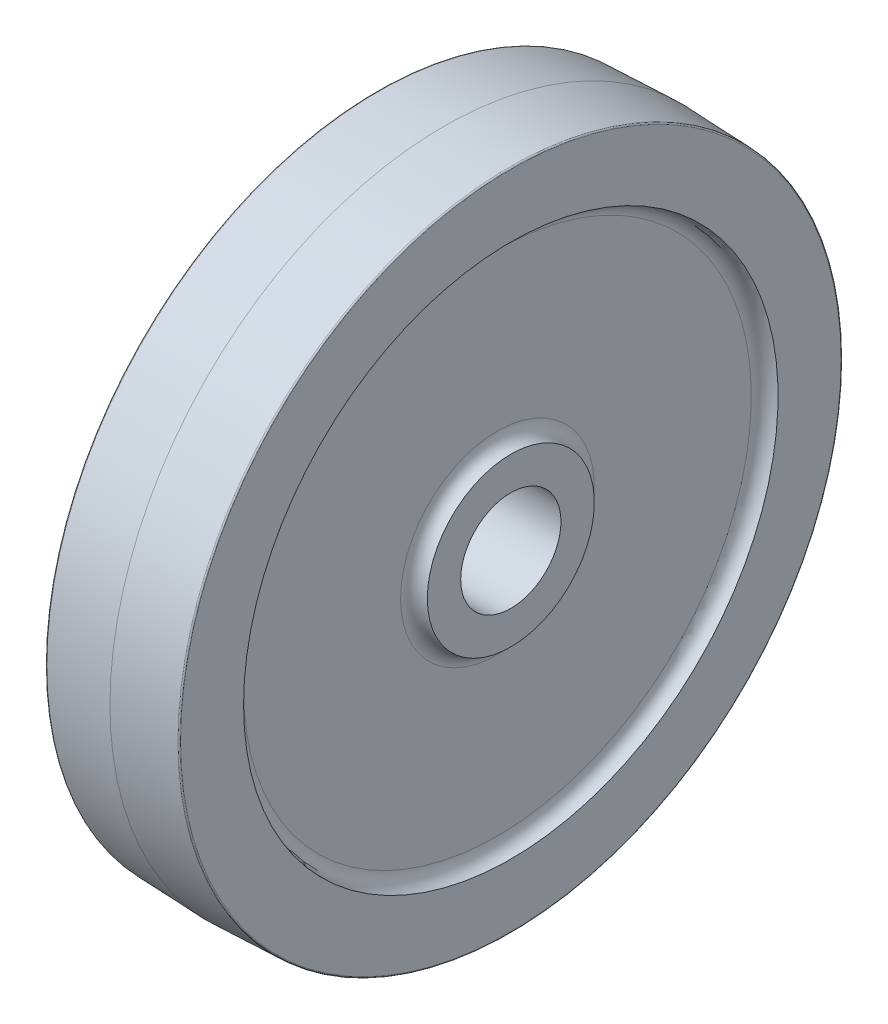
ISO-10303-21;
HEADER;
FILE_DESCRIPTION(('STEP AP214'),'2;1');
FILE_NAME('part.step','',(''),(''),'','','');
FILE_SCHEMA(('AUTOMOTIVE_DESIGN { 1 0 10303 214 1 1 1 1 }'));
ENDSEC;
DATA;
#1=APPLICATION_CONTEXT('core data for automotive mechanical design processes');
#2=APPLICATION_PROTOCOL_DEFINITION('international standard','automotive_design',2000,#1);
#3=PRODUCT_CONTEXT('',#1,'mechanical');
#4=PRODUCT('Part','Part','',(#3));
#5=PRODUCT_RELATED_PRODUCT_CATEGORY('part','',(#4));
#6=PRODUCT_DEFINITION_FORMATION('','',#4);
#7=PRODUCT_DEFINITION_CONTEXT('part definition',#1,'design');
#8=PRODUCT_DEFINITION('design','',#6,#7);
#9=PRODUCT_DEFINITION_SHAPE('','',#8);
#10=(LENGTH_UNIT() NAMED_UNIT(*) SI_UNIT(.MILLI.,.METRE.));
#11=(NAMED_UNIT(*) PLANE_ANGLE_UNIT() SI_UNIT($,.RADIAN.));
#12=(NAMED_UNIT(*) SI_UNIT($,.STERADIAN.) SOLID_ANGLE_UNIT());
#13=UNCERTAINTY_MEASURE_WITH_UNIT(LENGTH_MEASURE(1.E-05),#10,'distance_accuracy_value','');
#14=(GEOMETRIC_REPRESENTATION_CONTEXT(3) GLOBAL_UNCERTAINTY_ASSIGNED_CONTEXT((#13)) GLOBAL_UNIT_ASSIGNED_CONTEXT((#10,
#11,#12)) REPRESENTATION_CONTEXT('',''));
#15=CARTESIAN_POINT('',(0.,0.,0.));
#16=DIRECTION('',(0.,0.,1.));
#17=DIRECTION('',(1.,0.,0.));
#18=AXIS2_PLACEMENT_3D('',#15,#16,#17);
#19=CARTESIAN_POINT('',(10.4668676212676,0.,0.));
#20=DIRECTION('',(-1.,0.,0.));
#21=DIRECTION('',(0.,0.,1.));
#22=AXIS2_PLACEMENT_3D('',#19,#20,#21);
#23=TOROIDAL_SURFACE('',#22,62.7731550712937,0.254);
#24=CARTESIAN_POINT('',(10.4765068324478,0.,0.));
#25=DIRECTION('',(-1.,0.,0.));
#26=DIRECTION('',(0.,0.,1.));
#27=AXIS2_PLACEMENT_3D('',#24,#25,#26);
#28=CIRCLE('',#27,63.0269721030465);
#29=CARTESIAN_POINT('',(10.4765068324478,0.,63.0269721030465));
#30=VERTEX_POINT('',#29);
#31=EDGE_CURVE('E10',#30,#30,#28,.T.);
#32=ORIENTED_EDGE('',*,*,#31,.F.);
#33=EDGE_LOOP('',(#32));
#34=FACE_BOUND('',#33,.T.);
#35=CARTESIAN_POINT('',(10.7208676212676,0.,0.));
#36=DIRECTION('',(-1.,0.,0.));
#37=DIRECTION('',(0.,0.,1.));
#38=AXIS2_PLACEMENT_3D('',#35,#36,#37);
#39=CIRCLE('',#38,62.7731550712937);
#40=CARTESIAN_POINT('',(10.7208676212676,0.,62.7731550712937));
#41=VERTEX_POINT('',#40);
#42=EDGE_CURVE('E64',#41,#41,#39,.T.);
#43=ORIENTED_EDGE('',*,*,#42,.T.);
#44=EDGE_LOOP('',(#43));
#45=FACE_BOUND('',#44,.T.);
#46=ADVANCED_FACE('F15',(#34,#45),#23,.T.);
#47=CARTESIAN_POINT('',(10.4765068324478,0.,0.));
#48=DIRECTION('',(-1.,0.,0.));
#49=DIRECTION('',(0.,0.,1.));
#50=AXIS2_PLACEMENT_3D('',#47,#48,#49);
#51=CONICAL_SURFACE('',#50,63.0269721030465,0.0379587652532191);
#52=CARTESIAN_POINT('',(-1.97913237873238,0.,0.));
#53=DIRECTION('',(-1.,0.,0.));
#54=DIRECTION('',(0.,0.,1.));
#55=AXIS2_PLACEMENT_3D('',#52,#53,#54);
#56=CIRCLE('',#55,63.5);
#57=CARTESIAN_POINT('',(-1.97913237873238,0.,63.5));
#58=VERTEX_POINT('',#57);
#59=EDGE_CURVE('E21',#58,#58,#56,.T.);
#60=ORIENTED_EDGE('',*,*,#59,.F.);
#61=EDGE_LOOP('',(#60));
#62=FACE_BOUND('',#61,.T.);
#63=ORIENTED_EDGE('',*,*,#31,.T.);
#64=EDGE_LOOP('',(#63));
#65=FACE_BOUND('',#64,.T.);
#66=ADVANCED_FACE('F143',(#62,#65),#51,.T.);
#67=CARTESIAN_POINT('',(-1.97913237873238,0.,0.));
#68=DIRECTION('',(1.,0.,0.));
#69=DIRECTION('',(0.,0.,-1.));
#70=AXIS2_PLACEMENT_3D('',#67,#68,#69);
#71=CONICAL_SURFACE('',#70,63.5,0.037958765253218);
#72=CARTESIAN_POINT('',(-14.4347715899126,0.,0.));
#73=DIRECTION('',(-1.,0.,0.));
#74=DIRECTION('',(0.,0.,1.));
#75=AXIS2_PLACEMENT_3D('',#72,#73,#74);
#76=CIRCLE('',#75,63.0269721030465);
#77=CARTESIAN_POINT('',(-14.4347715899126,0.,63.0269721030465));
#78=VERTEX_POINT('',#77);
#79=EDGE_CURVE('E25',#78,#78,#76,.T.);
#80=ORIENTED_EDGE('',*,*,#79,.F.);
#81=EDGE_LOOP('',(#80));
#82=FACE_BOUND('',#81,.T.);
#83=ORIENTED_EDGE('',*,*,#59,.T.);
#84=EDGE_LOOP('',(#83));
#85=FACE_BOUND('',#84,.T.);
#86=ADVANCED_FACE('F138',(#82,#85),#71,.T.);
#87=CARTESIAN_POINT('',(-14.4251323787324,0.,0.));
#88=DIRECTION('',(-1.,0.,0.));
#89=DIRECTION('',(0.,0.,1.));
#90=AXIS2_PLACEMENT_3D('',#87,#88,#89);
#91=TOROIDAL_SURFACE('',#90,62.7731550712937,0.253999999999992);
#92=CARTESIAN_POINT('',(-14.6791323787324,0.,0.));
#93=DIRECTION('',(-1.,0.,0.));
#94=DIRECTION('',(0.,0.,1.));
#95=AXIS2_PLACEMENT_3D('',#92,#93,#94);
#96=CIRCLE('',#95,62.7731550712937);
#97=CARTESIAN_POINT('',(-14.6791323787324,0.,62.7731550712937));
#98=VERTEX_POINT('',#97);
#99=EDGE_CURVE('E29',#98,#98,#96,.T.);
#100=ORIENTED_EDGE('',*,*,#99,.F.);
#101=EDGE_LOOP('',(#100));
#102=FACE_BOUND('',#101,.T.);
#103=ORIENTED_EDGE('',*,*,#79,.T.);
#104=EDGE_LOOP('',(#103));
#105=FACE_BOUND('',#104,.T.);
#106=ADVANCED_FACE('F132',(#102,#105),#91,.T.);
#107=CARTESIAN_POINT('',(-14.6791323787324,62.7731550712937,0.));
#108=DIRECTION('',(1.,0.,0.));
#109=DIRECTION('',(0.,0.,-1.));
#110=AXIS2_PLACEMENT_3D('',#107,#108,#109);
#111=PLANE('',#110);
#112=CARTESIAN_POINT('',(-14.6791323787324,0.,0.));
#113=DIRECTION('',(-1.,0.,0.));
#114=DIRECTION('',(0.,0.,1.));
#115=AXIS2_PLACEMENT_3D('',#112,#113,#114);
#116=CIRCLE('',#115,50.8);
#117=CARTESIAN_POINT('',(-14.6791323787324,0.,50.8));
#118=VERTEX_POINT('',#117);
#119=EDGE_CURVE('E34',#118,#118,#116,.T.);
#120=ORIENTED_EDGE('',*,*,#119,.F.);
#121=EDGE_LOOP('',(#120));
#122=FACE_BOUND('',#121,.T.);
#123=ORIENTED_EDGE('',*,*,#99,.T.);
#124=EDGE_LOOP('',(#123));
#125=FACE_BOUND('',#124,.T.);
#126=ADVANCED_FACE('F126',(#122,#125),#111,.F.);
#127=CARTESIAN_POINT('',(-14.6791323787324,0.,0.));
#128=DIRECTION('',(-1.,0.,0.));
#129=DIRECTION('',(0.,0.,1.));
#130=AXIS2_PLACEMENT_3D('',#127,#128,#129);
#131=TOROIDAL_SURFACE('',#130,48.26,2.54);
#132=CARTESIAN_POINT('',(-12.1391323787324,0.,0.));
#133=DIRECTION('',(-1.,0.,0.));
#134=DIRECTION('',(0.,0.,1.));
#135=AXIS2_PLACEMENT_3D('',#132,#133,#134);
#136=CIRCLE('',#135,48.26);
#137=CARTESIAN_POINT('',(-12.1391323787324,0.,48.26));
#138=VERTEX_POINT('',#137);
#139=EDGE_CURVE('E37',#138,#138,#136,.T.);
#140=ORIENTED_EDGE('',*,*,#139,.F.);
#141=EDGE_LOOP('',(#140));
#142=FACE_BOUND('',#141,.T.);
#143=ORIENTED_EDGE('',*,*,#119,.T.);
#144=EDGE_LOOP('',(#143));
#145=FACE_BOUND('',#144,.T.);
#146=ADVANCED_FACE('F120',(#142,#145),#131,.F.);
#147=CARTESIAN_POINT('',(-12.1391323787324,48.26,0.));
#148=DIRECTION('',(1.,0.,0.));
#149=DIRECTION('',(0.,0.,-1.));
#150=AXIS2_PLACEMENT_3D('',#147,#148,#149);
#151=PLANE('',#150);
#152=CARTESIAN_POINT('',(-12.1391323787324,0.,0.));
#153=DIRECTION('',(-1.,0.,0.));
#154=DIRECTION('',(0.,0.,1.));
#155=AXIS2_PLACEMENT_3D('',#152,#153,#154);
#156=CIRCLE('',#155,18.415);
#157=CARTESIAN_POINT('',(-12.1391323787324,0.,18.415));
#158=VERTEX_POINT('',#157);
#159=EDGE_CURVE('E40',#158,#158,#156,.T.);
#160=ORIENTED_EDGE('',*,*,#159,.F.);
#161=EDGE_LOOP('',(#160));
#162=FACE_BOUND('',#161,.T.);
#163=ORIENTED_EDGE('',*,*,#139,.T.);
#164=EDGE_LOOP('',(#163));
#165=FACE_BOUND('',#164,.T.);
#166=ADVANCED_FACE('F114',(#162,#165),#151,.F.);
#167=CARTESIAN_POINT('',(-14.6791323787324,0.,0.));
#168=DIRECTION('',(-1.,0.,0.));
#169=DIRECTION('',(0.,0.,1.));
#170=AXIS2_PLACEMENT_3D('',#167,#168,#169);
#171=TOROIDAL_SURFACE('',#170,18.415,2.54);
#172=CARTESIAN_POINT('',(-14.6791323787324,0.,0.));
#173=DIRECTION('',(-1.,0.,0.));
#174=DIRECTION('',(0.,0.,1.));
#175=AXIS2_PLACEMENT_3D('',#172,#173,#174);
#176=CIRCLE('',#175,15.875);
#177=CARTESIAN_POINT('',(-14.6791323787324,0.,15.875));
#178=VERTEX_POINT('',#177);
#179=EDGE_CURVE('E43',#178,#178,#176,.T.);
#180=ORIENTED_EDGE('',*,*,#179,.F.);
#181=EDGE_LOOP('',(#180));
#182=FACE_BOUND('',#181,.T.);
#183=ORIENTED_EDGE('',*,*,#159,.T.);
#184=EDGE_LOOP('',(#183));
#185=FACE_BOUND('',#184,.T.);
#186=ADVANCED_FACE('F108',(#182,#185),#171,.F.);
#187=CARTESIAN_POINT('',(-14.6791323787324,15.875,0.));
#188=DIRECTION('',(1.,0.,0.));
#189=DIRECTION('',(0.,0.,-1.));
#190=AXIS2_PLACEMENT_3D('',#187,#188,#189);
#191=PLANE('',#190);
#192=CARTESIAN_POINT('',(-14.6791323787324,0.,0.));
#193=DIRECTION('',(-1.,0.,0.));
#194=DIRECTION('',(0.,0.,1.));
#195=AXIS2_PLACEMENT_3D('',#192,#193,#194);
#196=CIRCLE('',#195,9.525);
#197=CARTESIAN_POINT('',(-14.6791323787324,0.,9.525));
#198=VERTEX_POINT('',#197);
#199=EDGE_CURVE('E46',#198,#198,#196,.T.);
#200=ORIENTED_EDGE('',*,*,#199,.F.);
#201=EDGE_LOOP('',(#200));
#202=FACE_BOUND('',#201,.T.);
#203=ORIENTED_EDGE('',*,*,#179,.T.);
#204=EDGE_LOOP('',(#203));
#205=FACE_BOUND('',#204,.T.);
#206=ADVANCED_FACE('F102',(#202,#205),#191,.F.);
#207=CARTESIAN_POINT('',(-18.9296481296481,0.,0.));
#208=DIRECTION('',(-1.,0.,0.));
#209=DIRECTION('',(0.,0.,1.));
#210=AXIS2_PLACEMENT_3D('',#207,#208,#209);
#211=CYLINDRICAL_SURFACE('',#210,9.525);
#212=CARTESIAN_POINT('',(10.7208676212676,0.,0.));
#213=DIRECTION('',(-1.,0.,0.));
#214=DIRECTION('',(0.,0.,1.));
#215=AXIS2_PLACEMENT_3D('',#212,#213,#214);
#216=CIRCLE('',#215,9.525);
#217=CARTESIAN_POINT('',(10.7208676212676,0.,9.525));
#218=VERTEX_POINT('',#217);
#219=EDGE_CURVE('E49',#218,#218,#216,.T.);
#220=ORIENTED_EDGE('',*,*,#219,.F.);
#221=EDGE_LOOP('',(#220));
#222=FACE_BOUND('',#221,.T.);
#223=ORIENTED_EDGE('',*,*,#199,.T.);
#224=EDGE_LOOP('',(#223));
#225=FACE_BOUND('',#224,.T.);
#226=ADVANCED_FACE('F96',(#222,#225),#211,.F.);
#227=CARTESIAN_POINT('',(10.7208676212676,15.875,0.));
#228=DIRECTION('',(-1.,0.,0.));
#229=DIRECTION('',(0.,0.,1.));
#230=AXIS2_PLACEMENT_3D('',#227,#228,#229);
#231=PLANE('',#230);
#232=CARTESIAN_POINT('',(10.7208676212676,0.,0.));
#233=DIRECTION('',(-1.,0.,0.));
#234=DIRECTION('',(0.,0.,1.));
#235=AXIS2_PLACEMENT_3D('',#232,#233,#234);
#236=CIRCLE('',#235,15.875);
#237=CARTESIAN_POINT('',(10.7208676212676,0.,15.875));
#238=VERTEX_POINT('',#237);
#239=EDGE_CURVE('E52',#238,#238,#236,.T.);
#240=ORIENTED_EDGE('',*,*,#239,.F.);
#241=EDGE_LOOP('',(#240));
#242=FACE_BOUND('',#241,.T.);
#243=ORIENTED_EDGE('',*,*,#219,.T.);
#244=EDGE_LOOP('',(#243));
#245=FACE_BOUND('',#244,.T.);
#246=ADVANCED_FACE('F90',(#242,#245),#231,.F.);
#247=CARTESIAN_POINT('',(10.7208676212676,0.,0.));
#248=DIRECTION('',(-1.,0.,0.));
#249=DIRECTION('',(0.,0.,1.));
#250=AXIS2_PLACEMENT_3D('',#247,#248,#249);
#251=TOROIDAL_SURFACE('',#250,18.415,2.54);
#252=CARTESIAN_POINT('',(8.18086762126762,0.,0.));
#253=DIRECTION('',(-1.,0.,0.));
#254=DIRECTION('',(0.,0.,1.));
#255=AXIS2_PLACEMENT_3D('',#252,#253,#254);
#256=CIRCLE('',#255,18.415);
#257=CARTESIAN_POINT('',(8.18086762126762,0.,18.415));
#258=VERTEX_POINT('',#257);
#259=EDGE_CURVE('E55',#258,#258,#256,.T.);
#260=ORIENTED_EDGE('',*,*,#259,.F.);
#261=EDGE_LOOP('',(#260));
#262=FACE_BOUND('',#261,.T.);
#263=ORIENTED_EDGE('',*,*,#239,.T.);
#264=EDGE_LOOP('',(#263));
#265=FACE_BOUND('',#264,.T.);
#266=ADVANCED_FACE('F84',(#262,#265),#251,.F.);
#267=CARTESIAN_POINT('',(8.18086762126762,48.26,0.));
#268=DIRECTION('',(-1.,0.,0.));
#269=DIRECTION('',(0.,0.,1.));
#270=AXIS2_PLACEMENT_3D('',#267,#268,#269);
#271=PLANE('',#270);
#272=CARTESIAN_POINT('',(8.18086762126763,0.,0.));
#273=DIRECTION('',(-1.,0.,0.));
#274=DIRECTION('',(0.,0.,1.));
#275=AXIS2_PLACEMENT_3D('',#272,#273,#274);
#276=CIRCLE('',#275,48.26);
#277=CARTESIAN_POINT('',(8.18086762126763,0.,48.26));
#278=VERTEX_POINT('',#277);
#279=EDGE_CURVE('E58',#278,#278,#276,.T.);
#280=ORIENTED_EDGE('',*,*,#279,.F.);
#281=EDGE_LOOP('',(#280));
#282=FACE_BOUND('',#281,.T.);
#283=ORIENTED_EDGE('',*,*,#259,.T.);
#284=EDGE_LOOP('',(#283));
#285=FACE_BOUND('',#284,.T.);
#286=ADVANCED_FACE('F78',(#282,#285),#271,.F.);
#287=CARTESIAN_POINT('',(10.7208676212676,0.,0.));
#288=DIRECTION('',(-1.,0.,0.));
#289=DIRECTION('',(0.,0.,1.));
#290=AXIS2_PLACEMENT_3D('',#287,#288,#289);
#291=TOROIDAL_SURFACE('',#290,48.26,2.54);
#292=CARTESIAN_POINT('',(10.7208676212676,0.,0.));
#293=DIRECTION('',(-1.,0.,0.));
#294=DIRECTION('',(0.,0.,1.));
#295=AXIS2_PLACEMENT_3D('',#292,#293,#294);
#296=CIRCLE('',#295,50.8);
#297=CARTESIAN_POINT('',(10.7208676212676,0.,50.8));
#298=VERTEX_POINT('',#297);
#299=EDGE_CURVE('E61',#298,#298,#296,.T.);
#300=ORIENTED_EDGE('',*,*,#299,.F.);
#301=EDGE_LOOP('',(#300));
#302=FACE_BOUND('',#301,.T.);
#303=ORIENTED_EDGE('',*,*,#279,.T.);
#304=EDGE_LOOP('',(#303));
#305=FACE_BOUND('',#304,.T.);
#306=ADVANCED_FACE('F72',(#302,#305),#291,.F.);
#307=CARTESIAN_POINT('',(10.7208676212676,62.7731550712937,0.));
#308=DIRECTION('',(-1.,0.,0.));
#309=DIRECTION('',(0.,0.,1.));
#310=AXIS2_PLACEMENT_3D('',#307,#308,#309);
#311=PLANE('',#310);
#312=ORIENTED_EDGE('',*,*,#42,.F.);
#313=EDGE_LOOP('',(#312));
#314=FACE_BOUND('',#313,.T.);
#315=ORIENTED_EDGE('',*,*,#299,.T.);
#316=EDGE_LOOP('',(#315));
#317=FACE_BOUND('',#316,.T.);
#318=ADVANCED_FACE('F69',(#314,#317),#311,.F.);
#319=CLOSED_SHELL('',(#46,#66,#86,#106,#126,#146,#166,#186,#206,#226,#246,#266,#286,#306,#318));
#320=MANIFOLD_SOLID_BREP('B1',#319);
#321=ADVANCED_BREP_SHAPE_REPRESENTATION('',(#18,#320),#14);
#322=SHAPE_DEFINITION_REPRESENTATION(#9,#321);
ENDSEC;
END-ISO-10303-21;
